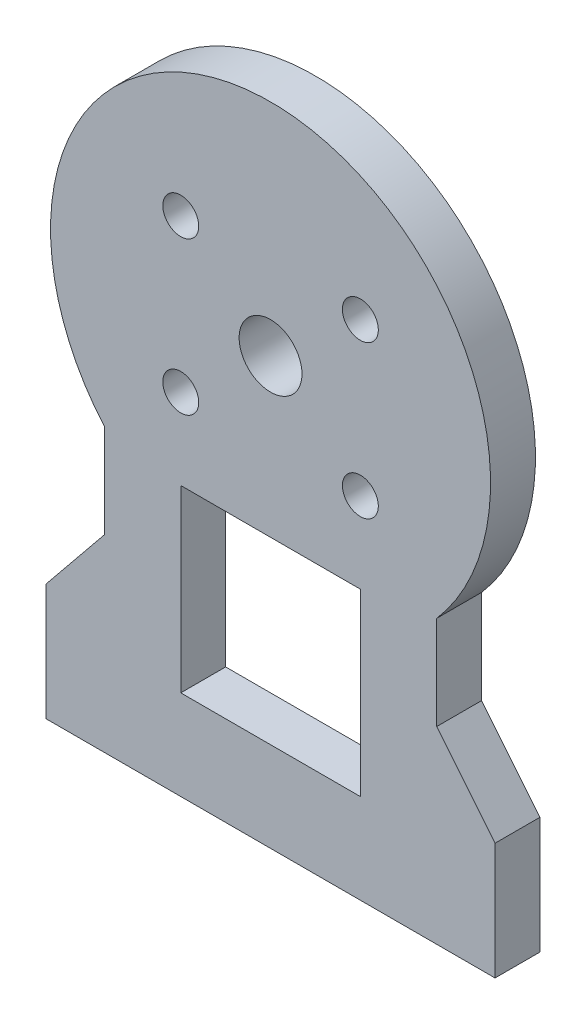
ISO-10303-21;
HEADER;
FILE_DESCRIPTION(('STEP AP214'),'2;1');
FILE_NAME('part.step','',(''),(''),'','','');
FILE_SCHEMA(('AUTOMOTIVE_DESIGN { 1 0 10303 214 1 1 1 1 }'));
ENDSEC;
DATA;
#1=APPLICATION_CONTEXT('core data for automotive mechanical design processes');
#2=APPLICATION_PROTOCOL_DEFINITION('international standard','automotive_design',2000,#1);
#3=PRODUCT_CONTEXT('',#1,'mechanical');
#4=PRODUCT('Part','Part','',(#3));
#5=PRODUCT_RELATED_PRODUCT_CATEGORY('part','',(#4));
#6=PRODUCT_DEFINITION_FORMATION('','',#4);
#7=PRODUCT_DEFINITION_CONTEXT('part definition',#1,'design');
#8=PRODUCT_DEFINITION('design','',#6,#7);
#9=PRODUCT_DEFINITION_SHAPE('','',#8);
#10=(LENGTH_UNIT() NAMED_UNIT(*) SI_UNIT(.MILLI.,.METRE.));
#11=(NAMED_UNIT(*) PLANE_ANGLE_UNIT() SI_UNIT($,.RADIAN.));
#12=(NAMED_UNIT(*) SI_UNIT($,.STERADIAN.) SOLID_ANGLE_UNIT());
#13=UNCERTAINTY_MEASURE_WITH_UNIT(LENGTH_MEASURE(1.E-05),#10,'distance_accuracy_value','');
#14=(GEOMETRIC_REPRESENTATION_CONTEXT(3) GLOBAL_UNCERTAINTY_ASSIGNED_CONTEXT((#13)) GLOBAL_UNIT_ASSIGNED_CONTEXT((#10,
#11,#12)) REPRESENTATION_CONTEXT('',''));
#15=CARTESIAN_POINT('',(0.,0.,0.));
#16=DIRECTION('',(0.,0.,1.));
#17=DIRECTION('',(1.,0.,0.));
#18=AXIS2_PLACEMENT_3D('',#15,#16,#17);
#19=CARTESIAN_POINT('',(0.,23.75,2.5));
#20=DIRECTION('',(0.,0.,1.));
#21=DIRECTION('',(1.,0.,0.));
#22=AXIS2_PLACEMENT_3D('',#19,#20,#21);
#23=PLANE('',#22);
#24=CARTESIAN_POINT('',(5.,19.5,2.5));
#25=DIRECTION('',(0.,0.,1.));
#26=DIRECTION('',(-1.,0.,0.));
#27=AXIS2_PLACEMENT_3D('',#24,#25,#26);
#28=CIRCLE('',#27,1.);
#29=CARTESIAN_POINT('',(4.,19.5,2.5));
#30=VERTEX_POINT('',#29);
#31=EDGE_CURVE('E322',#30,#30,#28,.T.);
#32=ORIENTED_EDGE('',*,*,#31,.F.);
#33=EDGE_LOOP('',(#32));
#34=FACE_BOUND('',#33,.T.);
#35=CARTESIAN_POINT('',(-5.,28.,2.5));
#36=DIRECTION('',(0.,0.,1.));
#37=DIRECTION('',(1.,0.,0.));
#38=AXIS2_PLACEMENT_3D('',#35,#36,#37);
#39=CIRCLE('',#38,1.);
#40=CARTESIAN_POINT('',(-4.,28.,2.5));
#41=VERTEX_POINT('',#40);
#42=EDGE_CURVE('E334',#41,#41,#39,.T.);
#43=ORIENTED_EDGE('',*,*,#42,.F.);
#44=EDGE_LOOP('',(#43));
#45=FACE_BOUND('',#44,.T.);
#46=DIRECTION('',(1.,0.,0.));
#47=VECTOR('',#46,1.);
#48=CARTESIAN_POINT('',(5.,5.,2.5));
#49=LINE('',#48,#47);
#50=CARTESIAN_POINT('',(-5.,5.,2.5));
#51=VERTEX_POINT('',#50);
#52=CARTESIAN_POINT('',(5.,5.,2.5));
#53=VERTEX_POINT('',#52);
#54=EDGE_CURVE('E129',#51,#53,#49,.T.);
#55=ORIENTED_EDGE('',*,*,#54,.F.);
#56=DIRECTION('',(0.,-1.,0.));
#57=VECTOR('',#56,1.);
#58=CARTESIAN_POINT('',(-5.,5.,2.5));
#59=LINE('',#58,#57);
#60=CARTESIAN_POINT('',(-5.,15.,2.5));
#61=VERTEX_POINT('',#60);
#62=EDGE_CURVE('E121',#61,#51,#59,.T.);
#63=ORIENTED_EDGE('',*,*,#62,.F.);
#64=DIRECTION('',(-1.,0.,0.));
#65=VECTOR('',#64,1.);
#66=CARTESIAN_POINT('',(-5.,15.,2.5));
#67=LINE('',#66,#65);
#68=CARTESIAN_POINT('',(5.,15.,2.5));
#69=VERTEX_POINT('',#68);
#70=EDGE_CURVE('E144',#69,#61,#67,.T.);
#71=ORIENTED_EDGE('',*,*,#70,.F.);
#72=DIRECTION('',(0.,1.,0.));
#73=VECTOR('',#72,1.);
#74=CARTESIAN_POINT('',(5.,5.,2.5));
#75=LINE('',#74,#73);
#76=EDGE_CURVE('E142',#53,#69,#75,.T.);
#77=ORIENTED_EDGE('',*,*,#76,.F.);
#78=EDGE_LOOP('',(#55,#63,#71,#77));
#79=FACE_BOUND('',#78,.T.);
#80=CARTESIAN_POINT('',(0.,23.75,2.5));
#81=DIRECTION('',(0.,0.,1.));
#82=DIRECTION('',(1.,0.,0.));
#83=AXIS2_PLACEMENT_3D('',#80,#81,#82);
#84=CIRCLE('',#83,12.25);
#85=CARTESIAN_POINT('',(9.25,15.7188107978955,2.5));
#86=VERTEX_POINT('',#85);
#87=CARTESIAN_POINT('',(-9.25,15.7188107978955,2.5));
#88=VERTEX_POINT('',#87);
#89=EDGE_CURVE('E160',#86,#88,#84,.T.);
#90=ORIENTED_EDGE('',*,*,#89,.T.);
#91=DIRECTION('',(0.,-1.,0.));
#92=VECTOR('',#91,1.);
#93=CARTESIAN_POINT('',(-9.25,15.7188107978955,2.5));
#94=LINE('',#93,#92);
#95=CARTESIAN_POINT('',(-9.25,10.5,2.5));
#96=VERTEX_POINT('',#95);
#97=EDGE_CURVE('E163',#88,#96,#94,.T.);
#98=ORIENTED_EDGE('',*,*,#97,.T.);
#99=DIRECTION('',(-0.630592625094466,-0.776114000116266,0.));
#100=VECTOR('',#99,1.);
#101=CARTESIAN_POINT('',(-12.5,6.5,2.5));
#102=LINE('',#101,#100);
#103=CARTESIAN_POINT('',(-12.5,6.5,2.5));
#104=VERTEX_POINT('',#103);
#105=EDGE_CURVE('E166',#96,#104,#102,.T.);
#106=ORIENTED_EDGE('',*,*,#105,.T.);
#107=DIRECTION('',(0.,-1.,0.));
#108=VECTOR('',#107,1.);
#109=CARTESIAN_POINT('',(-12.5,0.,2.5));
#110=LINE('',#109,#108);
#111=CARTESIAN_POINT('',(-12.5,0.,2.5));
#112=VERTEX_POINT('',#111);
#113=EDGE_CURVE('E168',#104,#112,#110,.T.);
#114=ORIENTED_EDGE('',*,*,#113,.T.);
#115=DIRECTION('',(1.,0.,0.));
#116=VECTOR('',#115,1.);
#117=CARTESIAN_POINT('',(12.5,0.,2.5));
#118=LINE('',#117,#116);
#119=CARTESIAN_POINT('',(12.5,0.,2.5));
#120=VERTEX_POINT('',#119);
#121=EDGE_CURVE('E170',#112,#120,#118,.T.);
#122=ORIENTED_EDGE('',*,*,#121,.T.);
#123=DIRECTION('',(0.,1.,0.));
#124=VECTOR('',#123,1.);
#125=CARTESIAN_POINT('',(12.5,0.,2.5));
#126=LINE('',#125,#124);
#127=CARTESIAN_POINT('',(12.5,6.5,2.5));
#128=VERTEX_POINT('',#127);
#129=EDGE_CURVE('E172',#120,#128,#126,.T.);
#130=ORIENTED_EDGE('',*,*,#129,.T.);
#131=DIRECTION('',(-0.630592625094466,0.776114000116266,0.));
#132=VECTOR('',#131,1.);
#133=CARTESIAN_POINT('',(12.5,6.5,2.5));
#134=LINE('',#133,#132);
#135=CARTESIAN_POINT('',(9.25,10.5,2.5));
#136=VERTEX_POINT('',#135);
#137=EDGE_CURVE('E174',#128,#136,#134,.T.);
#138=ORIENTED_EDGE('',*,*,#137,.T.);
#139=DIRECTION('',(0.,1.,0.));
#140=VECTOR('',#139,1.);
#141=CARTESIAN_POINT('',(9.25,15.7188107978955,2.5));
#142=LINE('',#141,#140);
#143=EDGE_CURVE('E176',#136,#86,#142,.T.);
#144=ORIENTED_EDGE('',*,*,#143,.T.);
#145=EDGE_LOOP('',(#90,#98,#106,#114,#122,#130,#138,#144));
#146=FACE_BOUND('',#145,.T.);
#147=CARTESIAN_POINT('',(0.,23.75,2.5));
#148=DIRECTION('',(0.,0.,1.));
#149=DIRECTION('',(1.,0.,0.));
#150=AXIS2_PLACEMENT_3D('',#147,#148,#149);
#151=CIRCLE('',#150,1.75);
#152=CARTESIAN_POINT('',(1.75,23.75,2.5));
#153=VERTEX_POINT('',#152);
#154=EDGE_CURVE('E150',#153,#153,#151,.T.);
#155=ORIENTED_EDGE('',*,*,#154,.F.);
#156=EDGE_LOOP('',(#155));
#157=FACE_BOUND('',#156,.T.);
#158=CARTESIAN_POINT('',(-5.,19.5,2.5));
#159=DIRECTION('',(0.,0.,1.));
#160=DIRECTION('',(1.,0.,0.));
#161=AXIS2_PLACEMENT_3D('',#158,#159,#160);
#162=CIRCLE('',#161,1.);
#163=CARTESIAN_POINT('',(-4.,19.5,2.5));
#164=VERTEX_POINT('',#163);
#165=EDGE_CURVE('E328',#164,#164,#162,.T.);
#166=ORIENTED_EDGE('',*,*,#165,.F.);
#167=EDGE_LOOP('',(#166));
#168=FACE_BOUND('',#167,.T.);
#169=CARTESIAN_POINT('',(5.,28.,2.5));
#170=DIRECTION('',(0.,0.,1.));
#171=DIRECTION('',(-1.,0.,0.));
#172=AXIS2_PLACEMENT_3D('',#169,#170,#171);
#173=CIRCLE('',#172,1.);
#174=CARTESIAN_POINT('',(4.,28.,2.5));
#175=VERTEX_POINT('',#174);
#176=EDGE_CURVE('E313',#175,#175,#173,.T.);
#177=ORIENTED_EDGE('',*,*,#176,.F.);
#178=EDGE_LOOP('',(#177));
#179=FACE_BOUND('',#178,.T.);
#180=ADVANCED_FACE('F32',(#34,#45,#79,#146,#157,#168,#179),#23,.T.);
#181=CARTESIAN_POINT('',(0.,23.75,0.));
#182=DIRECTION('',(0.,0.,1.));
#183=DIRECTION('',(1.,0.,0.));
#184=AXIS2_PLACEMENT_3D('',#181,#182,#183);
#185=PLANE('',#184);
#186=CARTESIAN_POINT('',(0.,23.75,0.));
#187=DIRECTION('',(0.,0.,1.));
#188=DIRECTION('',(1.,0.,0.));
#189=AXIS2_PLACEMENT_3D('',#186,#187,#188);
#190=CIRCLE('',#189,12.25);
#191=CARTESIAN_POINT('',(9.25,15.7188107978955,0.));
#192=VERTEX_POINT('',#191);
#193=CARTESIAN_POINT('',(-9.25,15.7188107978955,0.));
#194=VERTEX_POINT('',#193);
#195=EDGE_CURVE('E137',#192,#194,#190,.T.);
#196=ORIENTED_EDGE('',*,*,#195,.F.);
#197=DIRECTION('',(0.,1.,0.));
#198=VECTOR('',#197,1.);
#199=CARTESIAN_POINT('',(9.25,15.7188107978955,0.));
#200=LINE('',#199,#198);
#201=CARTESIAN_POINT('',(9.25,10.5,0.));
#202=VERTEX_POINT('',#201);
#203=EDGE_CURVE('E164',#202,#192,#200,.T.);
#204=ORIENTED_EDGE('',*,*,#203,.F.);
#205=DIRECTION('',(-0.630592625094466,0.776114000116266,0.));
#206=VECTOR('',#205,1.);
#207=CARTESIAN_POINT('',(12.5,6.5,0.));
#208=LINE('',#207,#206);
#209=CARTESIAN_POINT('',(12.5,6.5,0.));
#210=VERTEX_POINT('',#209);
#211=EDGE_CURVE('E191',#210,#202,#208,.T.);
#212=ORIENTED_EDGE('',*,*,#211,.F.);
#213=DIRECTION('',(0.,1.,0.));
#214=VECTOR('',#213,1.);
#215=CARTESIAN_POINT('',(12.5,0.,0.));
#216=LINE('',#215,#214);
#217=CARTESIAN_POINT('',(12.5,0.,0.));
#218=VERTEX_POINT('',#217);
#219=EDGE_CURVE('E189',#218,#210,#216,.T.);
#220=ORIENTED_EDGE('',*,*,#219,.F.);
#221=DIRECTION('',(1.,0.,0.));
#222=VECTOR('',#221,1.);
#223=CARTESIAN_POINT('',(12.5,0.,0.));
#224=LINE('',#223,#222);
#225=CARTESIAN_POINT('',(-12.5,0.,0.));
#226=VERTEX_POINT('',#225);
#227=EDGE_CURVE('E187',#226,#218,#224,.T.);
#228=ORIENTED_EDGE('',*,*,#227,.F.);
#229=DIRECTION('',(0.,-1.,0.));
#230=VECTOR('',#229,1.);
#231=CARTESIAN_POINT('',(-12.5,0.,0.));
#232=LINE('',#231,#230);
#233=CARTESIAN_POINT('',(-12.5,6.5,0.));
#234=VERTEX_POINT('',#233);
#235=EDGE_CURVE('E185',#234,#226,#232,.T.);
#236=ORIENTED_EDGE('',*,*,#235,.F.);
#237=DIRECTION('',(-0.630592625094466,-0.776114000116266,0.));
#238=VECTOR('',#237,1.);
#239=CARTESIAN_POINT('',(-12.5,6.5,0.));
#240=LINE('',#239,#238);
#241=CARTESIAN_POINT('',(-9.25,10.5,0.));
#242=VERTEX_POINT('',#241);
#243=EDGE_CURVE('E183',#242,#234,#240,.T.);
#244=ORIENTED_EDGE('',*,*,#243,.F.);
#245=DIRECTION('',(0.,-1.,0.));
#246=VECTOR('',#245,1.);
#247=CARTESIAN_POINT('',(-9.25,15.7188107978955,0.));
#248=LINE('',#247,#246);
#249=EDGE_CURVE('E181',#194,#242,#248,.T.);
#250=ORIENTED_EDGE('',*,*,#249,.F.);
#251=EDGE_LOOP('',(#196,#204,#212,#220,#228,#236,#244,#250));
#252=FACE_BOUND('',#251,.T.);
#253=DIRECTION('',(0.,-1.,0.));
#254=VECTOR('',#253,1.);
#255=CARTESIAN_POINT('',(-5.,5.,0.));
#256=LINE('',#255,#254);
#257=CARTESIAN_POINT('',(-5.,15.,0.));
#258=VERTEX_POINT('',#257);
#259=CARTESIAN_POINT('',(-5.,5.,0.));
#260=VERTEX_POINT('',#259);
#261=EDGE_CURVE('E55',#258,#260,#256,.T.);
#262=ORIENTED_EDGE('',*,*,#261,.T.);
#263=DIRECTION('',(1.,0.,0.));
#264=VECTOR('',#263,1.);
#265=CARTESIAN_POINT('',(5.,5.,0.));
#266=LINE('',#265,#264);
#267=CARTESIAN_POINT('',(5.,5.,0.));
#268=VERTEX_POINT('',#267);
#269=EDGE_CURVE('E136',#260,#268,#266,.T.);
#270=ORIENTED_EDGE('',*,*,#269,.T.);
#271=DIRECTION('',(0.,1.,0.));
#272=VECTOR('',#271,1.);
#273=CARTESIAN_POINT('',(5.,5.,0.));
#274=LINE('',#273,#272);
#275=CARTESIAN_POINT('',(5.,15.,0.));
#276=VERTEX_POINT('',#275);
#277=EDGE_CURVE('E152',#268,#276,#274,.T.);
#278=ORIENTED_EDGE('',*,*,#277,.T.);
#279=DIRECTION('',(-1.,0.,0.));
#280=VECTOR('',#279,1.);
#281=CARTESIAN_POINT('',(-5.,15.,0.));
#282=LINE('',#281,#280);
#283=EDGE_CURVE('E130',#276,#258,#282,.T.);
#284=ORIENTED_EDGE('',*,*,#283,.T.);
#285=EDGE_LOOP('',(#262,#270,#278,#284));
#286=FACE_BOUND('',#285,.T.);
#287=CARTESIAN_POINT('',(0.,23.75,0.));
#288=DIRECTION('',(0.,0.,1.));
#289=DIRECTION('',(1.,0.,0.));
#290=AXIS2_PLACEMENT_3D('',#287,#288,#289);
#291=CIRCLE('',#290,1.75);
#292=CARTESIAN_POINT('',(1.75,23.75,0.));
#293=VERTEX_POINT('',#292);
#294=EDGE_CURVE('E337',#293,#293,#291,.T.);
#295=ORIENTED_EDGE('',*,*,#294,.T.);
#296=EDGE_LOOP('',(#295));
#297=FACE_BOUND('',#296,.T.);
#298=CARTESIAN_POINT('',(-5.,28.,0.));
#299=DIRECTION('',(0.,0.,1.));
#300=DIRECTION('',(1.,0.,0.));
#301=AXIS2_PLACEMENT_3D('',#298,#299,#300);
#302=CIRCLE('',#301,1.);
#303=CARTESIAN_POINT('',(-4.,28.,0.));
#304=VERTEX_POINT('',#303);
#305=EDGE_CURVE('E331',#304,#304,#302,.T.);
#306=ORIENTED_EDGE('',*,*,#305,.T.);
#307=EDGE_LOOP('',(#306));
#308=FACE_BOUND('',#307,.T.);
#309=CARTESIAN_POINT('',(-5.,19.5,0.));
#310=DIRECTION('',(0.,0.,1.));
#311=DIRECTION('',(1.,0.,0.));
#312=AXIS2_PLACEMENT_3D('',#309,#310,#311);
#313=CIRCLE('',#312,1.);
#314=CARTESIAN_POINT('',(-4.,19.5,0.));
#315=VERTEX_POINT('',#314);
#316=EDGE_CURVE('E325',#315,#315,#313,.T.);
#317=ORIENTED_EDGE('',*,*,#316,.T.);
#318=EDGE_LOOP('',(#317));
#319=FACE_BOUND('',#318,.T.);
#320=CARTESIAN_POINT('',(5.,19.5,0.));
#321=DIRECTION('',(0.,0.,1.));
#322=DIRECTION('',(-1.,0.,0.));
#323=AXIS2_PLACEMENT_3D('',#320,#321,#322);
#324=CIRCLE('',#323,1.);
#325=CARTESIAN_POINT('',(4.,19.5,0.));
#326=VERTEX_POINT('',#325);
#327=EDGE_CURVE('E319',#326,#326,#324,.T.);
#328=ORIENTED_EDGE('',*,*,#327,.T.);
#329=EDGE_LOOP('',(#328));
#330=FACE_BOUND('',#329,.T.);
#331=CARTESIAN_POINT('',(5.,28.,0.));
#332=DIRECTION('',(0.,0.,1.));
#333=DIRECTION('',(-1.,0.,0.));
#334=AXIS2_PLACEMENT_3D('',#331,#332,#333);
#335=CIRCLE('',#334,1.);
#336=CARTESIAN_POINT('',(4.,28.,0.));
#337=VERTEX_POINT('',#336);
#338=EDGE_CURVE('E316',#337,#337,#335,.T.);
#339=ORIENTED_EDGE('',*,*,#338,.T.);
#340=EDGE_LOOP('',(#339));
#341=FACE_BOUND('',#340,.T.);
#342=ADVANCED_FACE('F221',(#252,#286,#297,#308,#319,#330,#341),#185,.F.);
#343=CARTESIAN_POINT('',(0.,23.75,2.5));
#344=DIRECTION('',(0.,0.,-1.));
#345=DIRECTION('',(-1.,0.,0.));
#346=AXIS2_PLACEMENT_3D('',#343,#344,#345);
#347=CYLINDRICAL_SURFACE('',#346,12.25);
#348=ORIENTED_EDGE('',*,*,#195,.T.);
#349=DIRECTION('',(0.,0.,-1.));
#350=VECTOR('',#349,1.);
#351=CARTESIAN_POINT('',(-9.25,15.7188107978955,2.5));
#352=LINE('',#351,#350);
#353=EDGE_CURVE('E11',#88,#194,#352,.T.);
#354=ORIENTED_EDGE('',*,*,#353,.F.);
#355=ORIENTED_EDGE('',*,*,#89,.F.);
#356=DIRECTION('',(0.,0.,-1.));
#357=VECTOR('',#356,1.);
#358=CARTESIAN_POINT('',(9.25,15.7188107978955,2.5));
#359=LINE('',#358,#357);
#360=EDGE_CURVE('E178',#86,#192,#359,.T.);
#361=ORIENTED_EDGE('',*,*,#360,.T.);
#362=EDGE_LOOP('',(#348,#354,#355,#361));
#363=FACE_BOUND('',#362,.T.);
#364=ADVANCED_FACE('F34',(#363),#347,.T.);
#365=CARTESIAN_POINT('',(-9.25,15.7188107978955,2.5));
#366=DIRECTION('',(1.,0.,0.));
#367=DIRECTION('',(0.,0.,-1.));
#368=AXIS2_PLACEMENT_3D('',#365,#366,#367);
#369=PLANE('',#368);
#370=ORIENTED_EDGE('',*,*,#249,.T.);
#371=DIRECTION('',(0.,0.,-1.));
#372=VECTOR('',#371,1.);
#373=CARTESIAN_POINT('',(-9.25,10.5,2.5));
#374=LINE('',#373,#372);
#375=EDGE_CURVE('E40',#96,#242,#374,.T.);
#376=ORIENTED_EDGE('',*,*,#375,.F.);
#377=ORIENTED_EDGE('',*,*,#97,.F.);
#378=ORIENTED_EDGE('',*,*,#353,.T.);
#379=EDGE_LOOP('',(#370,#376,#377,#378));
#380=FACE_BOUND('',#379,.T.);
#381=ADVANCED_FACE('F238',(#380),#369,.F.);
#382=CARTESIAN_POINT('',(-12.5,6.5,2.5));
#383=DIRECTION('',(0.776114000116266,-0.630592625094466,0.));
#384=DIRECTION('',(0.630592625094466,0.776114000116266,0.));
#385=AXIS2_PLACEMENT_3D('',#382,#383,#384);
#386=PLANE('',#385);
#387=ORIENTED_EDGE('',*,*,#243,.T.);
#388=DIRECTION('',(0.,0.,-1.));
#389=VECTOR('',#388,1.);
#390=CARTESIAN_POINT('',(-12.5,6.5,2.5));
#391=LINE('',#390,#389);
#392=EDGE_CURVE('E208',#104,#234,#391,.T.);
#393=ORIENTED_EDGE('',*,*,#392,.F.);
#394=ORIENTED_EDGE('',*,*,#105,.F.);
#395=ORIENTED_EDGE('',*,*,#375,.T.);
#396=EDGE_LOOP('',(#387,#393,#394,#395));
#397=FACE_BOUND('',#396,.T.);
#398=ADVANCED_FACE('F215',(#397),#386,.F.);
#399=CARTESIAN_POINT('',(-12.5,0.,2.5));
#400=DIRECTION('',(1.,0.,0.));
#401=DIRECTION('',(0.,0.,-1.));
#402=AXIS2_PLACEMENT_3D('',#399,#400,#401);
#403=PLANE('',#402);
#404=ORIENTED_EDGE('',*,*,#235,.T.);
#405=DIRECTION('',(0.,0.,-1.));
#406=VECTOR('',#405,1.);
#407=CARTESIAN_POINT('',(-12.5,0.,2.5));
#408=LINE('',#407,#406);
#409=EDGE_CURVE('E205',#112,#226,#408,.T.);
#410=ORIENTED_EDGE('',*,*,#409,.F.);
#411=ORIENTED_EDGE('',*,*,#113,.F.);
#412=ORIENTED_EDGE('',*,*,#392,.T.);
#413=EDGE_LOOP('',(#404,#410,#411,#412));
#414=FACE_BOUND('',#413,.T.);
#415=ADVANCED_FACE('F227',(#414),#403,.F.);
#416=CARTESIAN_POINT('',(12.5,0.,2.5));
#417=DIRECTION('',(0.,1.,0.));
#418=DIRECTION('',(0.,0.,1.));
#419=AXIS2_PLACEMENT_3D('',#416,#417,#418);
#420=PLANE('',#419);
#421=ORIENTED_EDGE('',*,*,#227,.T.);
#422=DIRECTION('',(0.,0.,-1.));
#423=VECTOR('',#422,1.);
#424=CARTESIAN_POINT('',(12.5,0.,2.5));
#425=LINE('',#424,#423);
#426=EDGE_CURVE('E202',#120,#218,#425,.T.);
#427=ORIENTED_EDGE('',*,*,#426,.F.);
#428=ORIENTED_EDGE('',*,*,#121,.F.);
#429=ORIENTED_EDGE('',*,*,#409,.T.);
#430=EDGE_LOOP('',(#421,#427,#428,#429));
#431=FACE_BOUND('',#430,.T.);
#432=ADVANCED_FACE('F231',(#431),#420,.F.);
#433=CARTESIAN_POINT('',(12.5,0.,2.5));
#434=DIRECTION('',(-1.,0.,0.));
#435=DIRECTION('',(0.,0.,1.));
#436=AXIS2_PLACEMENT_3D('',#433,#434,#435);
#437=PLANE('',#436);
#438=ORIENTED_EDGE('',*,*,#219,.T.);
#439=DIRECTION('',(0.,0.,-1.));
#440=VECTOR('',#439,1.);
#441=CARTESIAN_POINT('',(12.5,6.5,2.5));
#442=LINE('',#441,#440);
#443=EDGE_CURVE('E199',#128,#210,#442,.T.);
#444=ORIENTED_EDGE('',*,*,#443,.F.);
#445=ORIENTED_EDGE('',*,*,#129,.F.);
#446=ORIENTED_EDGE('',*,*,#426,.T.);
#447=EDGE_LOOP('',(#438,#444,#445,#446));
#448=FACE_BOUND('',#447,.T.);
#449=ADVANCED_FACE('F251',(#448),#437,.F.);
#450=CARTESIAN_POINT('',(12.5,6.5,2.5));
#451=DIRECTION('',(-0.776114000116266,-0.630592625094466,0.));
#452=DIRECTION('',(0.630592625094466,-0.776114000116266,0.));
#453=AXIS2_PLACEMENT_3D('',#450,#451,#452);
#454=PLANE('',#453);
#455=ORIENTED_EDGE('',*,*,#211,.T.);
#456=DIRECTION('',(0.,0.,-1.));
#457=VECTOR('',#456,1.);
#458=CARTESIAN_POINT('',(9.25,10.5,2.5));
#459=LINE('',#458,#457);
#460=EDGE_CURVE('E196',#136,#202,#459,.T.);
#461=ORIENTED_EDGE('',*,*,#460,.F.);
#462=ORIENTED_EDGE('',*,*,#137,.F.);
#463=ORIENTED_EDGE('',*,*,#443,.T.);
#464=EDGE_LOOP('',(#455,#461,#462,#463));
#465=FACE_BOUND('',#464,.T.);
#466=ADVANCED_FACE('F249',(#465),#454,.F.);
#467=CARTESIAN_POINT('',(9.25,15.7188107978955,2.5));
#468=DIRECTION('',(-1.,0.,0.));
#469=DIRECTION('',(0.,0.,1.));
#470=AXIS2_PLACEMENT_3D('',#467,#468,#469);
#471=PLANE('',#470);
#472=ORIENTED_EDGE('',*,*,#203,.T.);
#473=ORIENTED_EDGE('',*,*,#360,.F.);
#474=ORIENTED_EDGE('',*,*,#143,.F.);
#475=ORIENTED_EDGE('',*,*,#460,.T.);
#476=EDGE_LOOP('',(#472,#473,#474,#475));
#477=FACE_BOUND('',#476,.T.);
#478=ADVANCED_FACE('F244',(#477),#471,.F.);
#479=CARTESIAN_POINT('',(-5.,5.,2.5));
#480=DIRECTION('',(1.,0.,0.));
#481=DIRECTION('',(0.,0.,-1.));
#482=AXIS2_PLACEMENT_3D('',#479,#480,#481);
#483=PLANE('',#482);
#484=ORIENTED_EDGE('',*,*,#261,.F.);
#485=DIRECTION('',(0.,0.,-1.));
#486=VECTOR('',#485,1.);
#487=CARTESIAN_POINT('',(-5.,15.,2.5));
#488=LINE('',#487,#486);
#489=EDGE_CURVE('E125',#61,#258,#488,.T.);
#490=ORIENTED_EDGE('',*,*,#489,.F.);
#491=ORIENTED_EDGE('',*,*,#62,.T.);
#492=DIRECTION('',(0.,0.,-1.));
#493=VECTOR('',#492,1.);
#494=CARTESIAN_POINT('',(-5.,5.,2.5));
#495=LINE('',#494,#493);
#496=EDGE_CURVE('E124',#51,#260,#495,.T.);
#497=ORIENTED_EDGE('',*,*,#496,.T.);
#498=EDGE_LOOP('',(#484,#490,#491,#497));
#499=FACE_BOUND('',#498,.T.);
#500=ADVANCED_FACE('F123',(#499),#483,.T.);
#501=CARTESIAN_POINT('',(5.,5.,2.5));
#502=DIRECTION('',(0.,1.,0.));
#503=DIRECTION('',(0.,0.,1.));
#504=AXIS2_PLACEMENT_3D('',#501,#502,#503);
#505=PLANE('',#504);
#506=ORIENTED_EDGE('',*,*,#269,.F.);
#507=ORIENTED_EDGE('',*,*,#496,.F.);
#508=ORIENTED_EDGE('',*,*,#54,.T.);
#509=DIRECTION('',(0.,0.,-1.));
#510=VECTOR('',#509,1.);
#511=CARTESIAN_POINT('',(5.,5.,2.5));
#512=LINE('',#511,#510);
#513=EDGE_CURVE('E138',#53,#268,#512,.T.);
#514=ORIENTED_EDGE('',*,*,#513,.T.);
#515=EDGE_LOOP('',(#506,#507,#508,#514));
#516=FACE_BOUND('',#515,.T.);
#517=ADVANCED_FACE('F133',(#516),#505,.T.);
#518=CARTESIAN_POINT('',(5.,5.,2.5));
#519=DIRECTION('',(-1.,0.,0.));
#520=DIRECTION('',(0.,0.,1.));
#521=AXIS2_PLACEMENT_3D('',#518,#519,#520);
#522=PLANE('',#521);
#523=ORIENTED_EDGE('',*,*,#277,.F.);
#524=ORIENTED_EDGE('',*,*,#513,.F.);
#525=ORIENTED_EDGE('',*,*,#76,.T.);
#526=DIRECTION('',(0.,0.,-1.));
#527=VECTOR('',#526,1.);
#528=CARTESIAN_POINT('',(5.,15.,2.5));
#529=LINE('',#528,#527);
#530=EDGE_CURVE('E47',#69,#276,#529,.T.);
#531=ORIENTED_EDGE('',*,*,#530,.T.);
#532=EDGE_LOOP('',(#523,#524,#525,#531));
#533=FACE_BOUND('',#532,.T.);
#534=ADVANCED_FACE('F279',(#533),#522,.T.);
#535=CARTESIAN_POINT('',(-5.,15.,2.5));
#536=DIRECTION('',(0.,-1.,0.));
#537=DIRECTION('',(0.,0.,-1.));
#538=AXIS2_PLACEMENT_3D('',#535,#536,#537);
#539=PLANE('',#538);
#540=ORIENTED_EDGE('',*,*,#283,.F.);
#541=ORIENTED_EDGE('',*,*,#530,.F.);
#542=ORIENTED_EDGE('',*,*,#70,.T.);
#543=ORIENTED_EDGE('',*,*,#489,.T.);
#544=EDGE_LOOP('',(#540,#541,#542,#543));
#545=FACE_BOUND('',#544,.T.);
#546=ADVANCED_FACE('F283',(#545),#539,.T.);
#547=CARTESIAN_POINT('',(0.,23.75,2.5));
#548=DIRECTION('',(0.,0.,-1.));
#549=DIRECTION('',(-1.,0.,0.));
#550=AXIS2_PLACEMENT_3D('',#547,#548,#549);
#551=CYLINDRICAL_SURFACE('',#550,1.75);
#552=ORIENTED_EDGE('',*,*,#154,.T.);
#553=EDGE_LOOP('',(#552));
#554=FACE_BOUND('',#553,.T.);
#555=ORIENTED_EDGE('',*,*,#294,.F.);
#556=EDGE_LOOP('',(#555));
#557=FACE_BOUND('',#556,.T.);
#558=ADVANCED_FACE('F289',(#554,#557),#551,.F.);
#559=CARTESIAN_POINT('',(-5.,28.,2.5));
#560=DIRECTION('',(0.,0.,-1.));
#561=DIRECTION('',(-1.,0.,0.));
#562=AXIS2_PLACEMENT_3D('',#559,#560,#561);
#563=CYLINDRICAL_SURFACE('',#562,1.);
#564=ORIENTED_EDGE('',*,*,#42,.T.);
#565=EDGE_LOOP('',(#564));
#566=FACE_BOUND('',#565,.T.);
#567=ORIENTED_EDGE('',*,*,#305,.F.);
#568=EDGE_LOOP('',(#567));
#569=FACE_BOUND('',#568,.T.);
#570=ADVANCED_FACE('F292',(#566,#569),#563,.F.);
#571=CARTESIAN_POINT('',(-5.,19.5,2.5));
#572=DIRECTION('',(0.,0.,-1.));
#573=DIRECTION('',(-1.,0.,0.));
#574=AXIS2_PLACEMENT_3D('',#571,#572,#573);
#575=CYLINDRICAL_SURFACE('',#574,1.);
#576=ORIENTED_EDGE('',*,*,#165,.T.);
#577=EDGE_LOOP('',(#576));
#578=FACE_BOUND('',#577,.T.);
#579=ORIENTED_EDGE('',*,*,#316,.F.);
#580=EDGE_LOOP('',(#579));
#581=FACE_BOUND('',#580,.T.);
#582=ADVANCED_FACE('F296',(#578,#581),#575,.F.);
#583=CARTESIAN_POINT('',(5.,19.5,2.5));
#584=DIRECTION('',(0.,0.,-1.));
#585=DIRECTION('',(-1.,0.,0.));
#586=AXIS2_PLACEMENT_3D('',#583,#584,#585);
#587=CYLINDRICAL_SURFACE('',#586,1.);
#588=ORIENTED_EDGE('',*,*,#31,.T.);
#589=EDGE_LOOP('',(#588));
#590=FACE_BOUND('',#589,.T.);
#591=ORIENTED_EDGE('',*,*,#327,.F.);
#592=EDGE_LOOP('',(#591));
#593=FACE_BOUND('',#592,.T.);
#594=ADVANCED_FACE('F300',(#590,#593),#587,.F.);
#595=CARTESIAN_POINT('',(5.,28.,2.5));
#596=DIRECTION('',(0.,0.,-1.));
#597=DIRECTION('',(-1.,0.,0.));
#598=AXIS2_PLACEMENT_3D('',#595,#596,#597);
#599=CYLINDRICAL_SURFACE('',#598,1.);
#600=ORIENTED_EDGE('',*,*,#176,.T.);
#601=EDGE_LOOP('',(#600));
#602=FACE_BOUND('',#601,.T.);
#603=ORIENTED_EDGE('',*,*,#338,.F.);
#604=EDGE_LOOP('',(#603));
#605=FACE_BOUND('',#604,.T.);
#606=ADVANCED_FACE('F304',(#602,#605),#599,.F.);
#607=CLOSED_SHELL('',(#180,#342,#364,#381,#398,#415,#432,#449,#466,#478,#500,#517,#534,#546,
#558,#570,#582,#594,#606));
#608=MANIFOLD_SOLID_BREP('B2',#607);
#609=ADVANCED_BREP_SHAPE_REPRESENTATION('',(#18,#608),#14);
#610=SHAPE_DEFINITION_REPRESENTATION(#9,#609);
ENDSEC;
END-ISO-10303-21;
